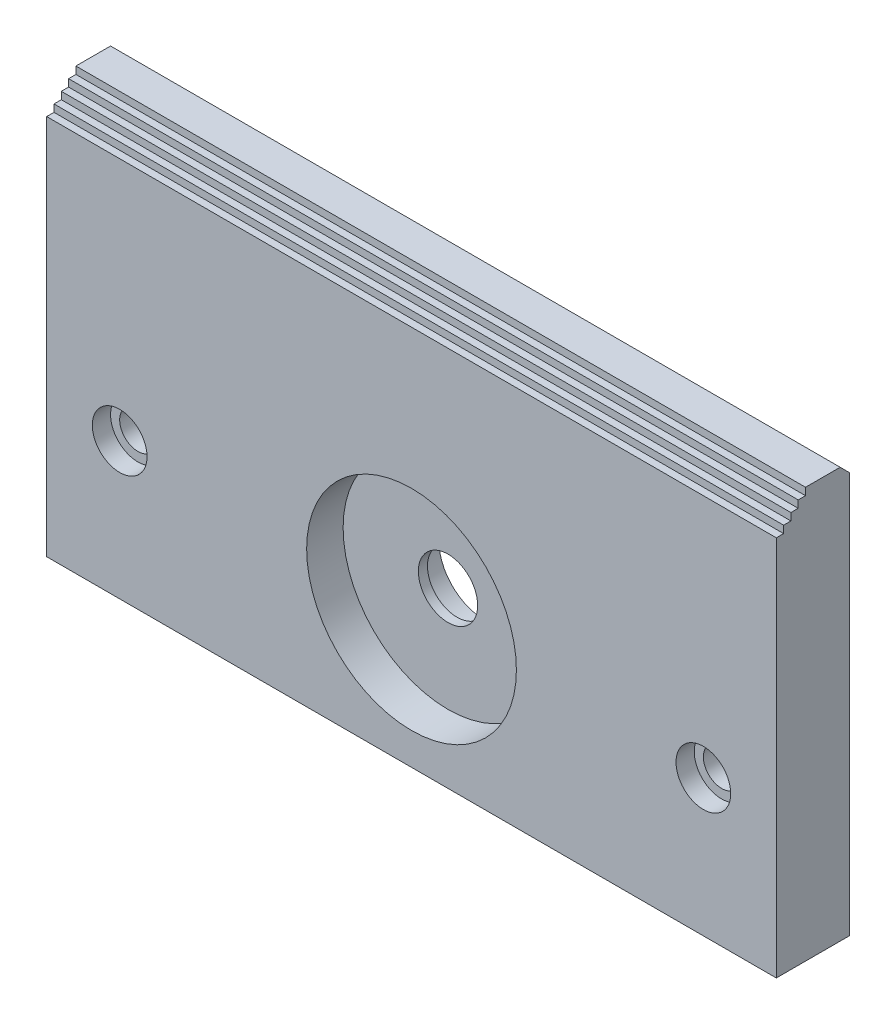
ISO-10303-21;
HEADER;
FILE_DESCRIPTION(('STEP AP214'),'2;1');
FILE_NAME('part.step','',(''),(''),'','','');
FILE_SCHEMA(('AUTOMOTIVE_DESIGN { 1 0 10303 214 1 1 1 1 }'));
ENDSEC;
DATA;
#1=APPLICATION_CONTEXT('core data for automotive mechanical design processes');
#2=APPLICATION_PROTOCOL_DEFINITION('international standard','automotive_design',2000,#1);
#3=PRODUCT_CONTEXT('',#1,'mechanical');
#4=PRODUCT('Part','Part','',(#3));
#5=PRODUCT_RELATED_PRODUCT_CATEGORY('part','',(#4));
#6=PRODUCT_DEFINITION_FORMATION('','',#4);
#7=PRODUCT_DEFINITION_CONTEXT('part definition',#1,'design');
#8=PRODUCT_DEFINITION('design','',#6,#7);
#9=PRODUCT_DEFINITION_SHAPE('','',#8);
#10=(LENGTH_UNIT() NAMED_UNIT(*) SI_UNIT(.MILLI.,.METRE.));
#11=(NAMED_UNIT(*) PLANE_ANGLE_UNIT() SI_UNIT($,.RADIAN.));
#12=(NAMED_UNIT(*) SI_UNIT($,.STERADIAN.) SOLID_ANGLE_UNIT());
#13=UNCERTAINTY_MEASURE_WITH_UNIT(LENGTH_MEASURE(1.E-05),#10,'distance_accuracy_value','');
#14=(GEOMETRIC_REPRESENTATION_CONTEXT(3) GLOBAL_UNCERTAINTY_ASSIGNED_CONTEXT((#13)) GLOBAL_UNIT_ASSIGNED_CONTEXT((#10,
#11,#12)) REPRESENTATION_CONTEXT('',''));
#15=CARTESIAN_POINT('',(0.,0.,0.));
#16=DIRECTION('',(0.,0.,1.));
#17=DIRECTION('',(1.,0.,0.));
#18=AXIS2_PLACEMENT_3D('',#15,#16,#17);
#19=CARTESIAN_POINT('',(40.,10.8333333333333,-0.0010000000000062));
#20=DIRECTION('',(0.,0.,1.));
#21=DIRECTION('',(1.,0.,0.));
#22=AXIS2_PLACEMENT_3D('',#19,#20,#21);
#23=CYLINDRICAL_SURFACE('',#22,3.25);
#24=CARTESIAN_POINT('',(40.,10.8333333333333,4.));
#25=DIRECTION('',(0.,0.,1.));
#26=DIRECTION('',(1.,0.,0.));
#27=AXIS2_PLACEMENT_3D('',#24,#25,#26);
#28=CIRCLE('',#27,3.25);
#29=CARTESIAN_POINT('',(43.25,10.8333333333333,4.));
#30=VERTEX_POINT('',#29);
#31=EDGE_CURVE('E302',#30,#30,#28,.F.);
#32=ORIENTED_EDGE('',*,*,#31,.F.);
#33=EDGE_LOOP('',(#32));
#34=FACE_BOUND('',#33,.T.);
#35=CARTESIAN_POINT('',(40.,10.8333333333333,3.));
#36=DIRECTION('',(0.,0.,-1.));
#37=DIRECTION('',(-1.,0.,0.));
#38=AXIS2_PLACEMENT_3D('',#35,#36,#37);
#39=CIRCLE('',#38,3.25);
#40=CARTESIAN_POINT('',(36.75,10.8333333333333,3.));
#41=VERTEX_POINT('',#40);
#42=EDGE_CURVE('E308',#41,#41,#39,.F.);
#43=ORIENTED_EDGE('',*,*,#42,.F.);
#44=EDGE_LOOP('',(#43));
#45=FACE_BOUND('',#44,.T.);
#46=ADVANCED_FACE('F161',(#34,#45),#23,.F.);
#47=CARTESIAN_POINT('',(80.,40.8333333333333,0.));
#48=DIRECTION('',(0.,1.,0.));
#49=DIRECTION('',(-1.,0.,0.));
#50=AXIS2_PLACEMENT_3D('',#47,#48,#49);
#51=PLANE('',#50);
#52=DIRECTION('',(-1.,0.,0.));
#53=VECTOR('',#52,1.);
#54=CARTESIAN_POINT('',(80.001,40.8333333333333,4.8));
#55=LINE('',#54,#53);
#56=CARTESIAN_POINT('',(80.,40.8333333333333,4.8));
#57=VERTEX_POINT('',#56);
#58=CARTESIAN_POINT('',(0.,40.8333333333333,4.8));
#59=VERTEX_POINT('',#58);
#60=EDGE_CURVE('E353',#57,#59,#55,.T.);
#61=ORIENTED_EDGE('',*,*,#60,.F.);
#62=DIRECTION('',(0.,0.,1.));
#63=VECTOR('',#62,1.);
#64=CARTESIAN_POINT('',(80.,40.8333333333333,0.));
#65=LINE('',#64,#63);
#66=CARTESIAN_POINT('',(80.,40.8333333333333,0.999999999999973));
#67=VERTEX_POINT('',#66);
#68=EDGE_CURVE('E298',#67,#57,#65,.T.);
#69=ORIENTED_EDGE('',*,*,#68,.F.);
#70=DIRECTION('',(-1.,0.,0.));
#71=VECTOR('',#70,1.);
#72=CARTESIAN_POINT('',(0.,40.8333333333333,0.999999999999973));
#73=LINE('',#72,#71);
#74=CARTESIAN_POINT('',(0.,40.8333333333333,0.999999999999973));
#75=VERTEX_POINT('',#74);
#76=EDGE_CURVE('E329',#67,#75,#73,.T.);
#77=ORIENTED_EDGE('',*,*,#76,.T.);
#78=DIRECTION('',(0.,0.,1.));
#79=VECTOR('',#78,1.);
#80=CARTESIAN_POINT('',(0.,40.8333333333333,0.));
#81=LINE('',#80,#79);
#82=EDGE_CURVE('E293',#75,#59,#81,.T.);
#83=ORIENTED_EDGE('',*,*,#82,.T.);
#84=EDGE_LOOP('',(#61,#69,#77,#83));
#85=FACE_BOUND('',#84,.T.);
#86=ADVANCED_FACE('F351',(#85),#51,.T.);
#87=CARTESIAN_POINT('',(0.,40.8333333333333,0.));
#88=DIRECTION('',(-1.,0.,0.));
#89=DIRECTION('',(0.,-1.,0.));
#90=AXIS2_PLACEMENT_3D('',#87,#88,#89);
#91=PLANE('',#90);
#92=DIRECTION('',(0.,0.,1.));
#93=VECTOR('',#92,1.);
#94=CARTESIAN_POINT('',(0.,37.6333333333333,7.2));
#95=LINE('',#94,#93);
#96=CARTESIAN_POINT('',(0.,37.6333333333333,7.2));
#97=VERTEX_POINT('',#96);
#98=CARTESIAN_POINT('',(0.,37.6333333333333,8.));
#99=VERTEX_POINT('',#98);
#100=EDGE_CURVE('E178',#97,#99,#95,.T.);
#101=ORIENTED_EDGE('',*,*,#100,.F.);
#102=DIRECTION('',(0.,-1.,0.));
#103=VECTOR('',#102,1.);
#104=CARTESIAN_POINT('',(0.,38.4333333333333,7.2));
#105=LINE('',#104,#103);
#106=CARTESIAN_POINT('',(0.,38.4333333333333,7.2));
#107=VERTEX_POINT('',#106);
#108=EDGE_CURVE('E364',#107,#97,#105,.T.);
#109=ORIENTED_EDGE('',*,*,#108,.F.);
#110=DIRECTION('',(0.,0.,1.));
#111=VECTOR('',#110,1.);
#112=CARTESIAN_POINT('',(0.,38.4333333333333,6.4));
#113=LINE('',#112,#111);
#114=CARTESIAN_POINT('',(0.,38.4333333333333,6.4));
#115=VERTEX_POINT('',#114);
#116=EDGE_CURVE('E439',#115,#107,#113,.T.);
#117=ORIENTED_EDGE('',*,*,#116,.F.);
#118=DIRECTION('',(0.,-1.,0.));
#119=VECTOR('',#118,1.);
#120=CARTESIAN_POINT('',(0.,39.2333333333333,6.4));
#121=LINE('',#120,#119);
#122=CARTESIAN_POINT('',(0.,39.2333333333333,6.4));
#123=VERTEX_POINT('',#122);
#124=EDGE_CURVE('E435',#123,#115,#121,.T.);
#125=ORIENTED_EDGE('',*,*,#124,.F.);
#126=DIRECTION('',(0.,0.,1.));
#127=VECTOR('',#126,1.);
#128=CARTESIAN_POINT('',(0.,39.2333333333333,5.6));
#129=LINE('',#128,#127);
#130=CARTESIAN_POINT('',(0.,39.2333333333333,5.6));
#131=VERTEX_POINT('',#130);
#132=EDGE_CURVE('E431',#131,#123,#129,.T.);
#133=ORIENTED_EDGE('',*,*,#132,.F.);
#134=DIRECTION('',(0.,-1.,0.));
#135=VECTOR('',#134,1.);
#136=CARTESIAN_POINT('',(0.,40.0333333333333,5.6));
#137=LINE('',#136,#135);
#138=CARTESIAN_POINT('',(0.,40.0333333333333,5.6));
#139=VERTEX_POINT('',#138);
#140=EDGE_CURVE('E424',#139,#131,#137,.T.);
#141=ORIENTED_EDGE('',*,*,#140,.F.);
#142=DIRECTION('',(0.,0.,1.));
#143=VECTOR('',#142,1.);
#144=CARTESIAN_POINT('',(0.,40.0333333333333,4.8));
#145=LINE('',#144,#143);
#146=CARTESIAN_POINT('',(0.,40.0333333333333,4.8));
#147=VERTEX_POINT('',#146);
#148=EDGE_CURVE('E419',#147,#139,#145,.T.);
#149=ORIENTED_EDGE('',*,*,#148,.F.);
#150=DIRECTION('',(0.,-1.,0.));
#151=VECTOR('',#150,1.);
#152=CARTESIAN_POINT('',(0.,40.8333333333333,4.8));
#153=LINE('',#152,#151);
#154=EDGE_CURVE('E271',#59,#147,#153,.T.);
#155=ORIENTED_EDGE('',*,*,#154,.F.);
#156=ORIENTED_EDGE('',*,*,#82,.F.);
#157=DIRECTION('',(0.,-0.707106781186552,-0.707106781186543));
#158=VECTOR('',#157,1.);
#159=CARTESIAN_POINT('',(0.,40.3333333333333,0.499999999999993));
#160=LINE('',#159,#158);
#161=CARTESIAN_POINT('',(0.,39.8333333333333,0.));
#162=VERTEX_POINT('',#161);
#163=EDGE_CURVE('E333',#75,#162,#160,.T.);
#164=ORIENTED_EDGE('',*,*,#163,.T.);
#165=DIRECTION('',(0.,-1.,0.));
#166=VECTOR('',#165,1.);
#167=CARTESIAN_POINT('',(0.,40.8333333333333,0.));
#168=LINE('',#167,#166);
#169=CARTESIAN_POINT('',(0.,-4.16666666666666,0.));
#170=VERTEX_POINT('',#169);
#171=EDGE_CURVE('E290',#162,#170,#168,.T.);
#172=ORIENTED_EDGE('',*,*,#171,.T.);
#173=DIRECTION('',(0.,0.,1.));
#174=VECTOR('',#173,1.);
#175=CARTESIAN_POINT('',(0.,-4.16666666666666,-0.000999999999999265));
#176=LINE('',#175,#174);
#177=CARTESIAN_POINT('',(0.,-4.16666666666666,8.));
#178=VERTEX_POINT('',#177);
#179=EDGE_CURVE('E376',#170,#178,#176,.T.);
#180=ORIENTED_EDGE('',*,*,#179,.T.);
#181=DIRECTION('',(0.,-1.,0.));
#182=VECTOR('',#181,1.);
#183=CARTESIAN_POINT('',(0.,40.8333333333333,8.));
#184=LINE('',#183,#182);
#185=EDGE_CURVE('E279',#99,#178,#184,.T.);
#186=ORIENTED_EDGE('',*,*,#185,.F.);
#187=EDGE_LOOP('',(#101,#109,#117,#125,#133,#141,#149,#155,#156,#164,#172,#180,#186));
#188=FACE_BOUND('',#187,.T.);
#189=ADVANCED_FACE('F415',(#188),#91,.T.);
#190=CARTESIAN_POINT('',(80.,-19.1666666666667,0.));
#191=DIRECTION('',(1.,0.,0.));
#192=DIRECTION('',(0.,0.,-1.));
#193=AXIS2_PLACEMENT_3D('',#190,#191,#192);
#194=PLANE('',#193);
#195=DIRECTION('',(0.,0.,1.));
#196=VECTOR('',#195,1.);
#197=CARTESIAN_POINT('',(80.,37.6333333333333,7.2));
#198=LINE('',#197,#196);
#199=CARTESIAN_POINT('',(80.,37.6333333333333,7.2));
#200=VERTEX_POINT('',#199);
#201=CARTESIAN_POINT('',(80.,37.6333333333333,8.));
#202=VERTEX_POINT('',#201);
#203=EDGE_CURVE('E258',#200,#202,#198,.T.);
#204=ORIENTED_EDGE('',*,*,#203,.T.);
#205=DIRECTION('',(0.,1.,0.));
#206=VECTOR('',#205,1.);
#207=CARTESIAN_POINT('',(80.,-19.1666666666667,8.));
#208=LINE('',#207,#206);
#209=CARTESIAN_POINT('',(80.,-4.16666666666666,8.));
#210=VERTEX_POINT('',#209);
#211=EDGE_CURVE('E186',#210,#202,#208,.T.);
#212=ORIENTED_EDGE('',*,*,#211,.F.);
#213=DIRECTION('',(0.,0.,1.));
#214=VECTOR('',#213,1.);
#215=CARTESIAN_POINT('',(80.,-4.16666666666666,-0.000999999999999265));
#216=LINE('',#215,#214);
#217=CARTESIAN_POINT('',(80.,-4.16666666666666,0.));
#218=VERTEX_POINT('',#217);
#219=EDGE_CURVE('E375',#218,#210,#216,.T.);
#220=ORIENTED_EDGE('',*,*,#219,.F.);
#221=DIRECTION('',(0.,1.,0.));
#222=VECTOR('',#221,1.);
#223=CARTESIAN_POINT('',(80.,-19.1666666666667,0.));
#224=LINE('',#223,#222);
#225=CARTESIAN_POINT('',(80.,39.8333333333334,0.));
#226=VERTEX_POINT('',#225);
#227=EDGE_CURVE('E284',#218,#226,#224,.T.);
#228=ORIENTED_EDGE('',*,*,#227,.T.);
#229=DIRECTION('',(0.,0.707106781186552,0.707106781186543));
#230=VECTOR('',#229,1.);
#231=CARTESIAN_POINT('',(80.,10.3333333333329,-29.5));
#232=LINE('',#231,#230);
#233=EDGE_CURVE('E12',#226,#67,#232,.T.);
#234=ORIENTED_EDGE('',*,*,#233,.T.);
#235=ORIENTED_EDGE('',*,*,#68,.T.);
#236=DIRECTION('',(0.,-1.,0.));
#237=VECTOR('',#236,1.);
#238=CARTESIAN_POINT('',(80.,40.8333333333333,4.8));
#239=LINE('',#238,#237);
#240=CARTESIAN_POINT('',(80.,40.0333333333333,4.8));
#241=VERTEX_POINT('',#240);
#242=EDGE_CURVE('E263',#57,#241,#239,.T.);
#243=ORIENTED_EDGE('',*,*,#242,.T.);
#244=DIRECTION('',(0.,0.,1.));
#245=VECTOR('',#244,1.);
#246=CARTESIAN_POINT('',(80.,40.0333333333333,4.8));
#247=LINE('',#246,#245);
#248=CARTESIAN_POINT('',(80.,40.0333333333333,5.6));
#249=VERTEX_POINT('',#248);
#250=EDGE_CURVE('E478',#241,#249,#247,.T.);
#251=ORIENTED_EDGE('',*,*,#250,.T.);
#252=DIRECTION('',(0.,-1.,0.));
#253=VECTOR('',#252,1.);
#254=CARTESIAN_POINT('',(80.,40.0333333333333,5.6));
#255=LINE('',#254,#253);
#256=CARTESIAN_POINT('',(80.,39.2333333333333,5.6));
#257=VERTEX_POINT('',#256);
#258=EDGE_CURVE('E466',#249,#257,#255,.T.);
#259=ORIENTED_EDGE('',*,*,#258,.T.);
#260=DIRECTION('',(0.,0.,1.));
#261=VECTOR('',#260,1.);
#262=CARTESIAN_POINT('',(80.,39.2333333333333,5.6));
#263=LINE('',#262,#261);
#264=CARTESIAN_POINT('',(80.,39.2333333333333,6.4));
#265=VERTEX_POINT('',#264);
#266=EDGE_CURVE('E476',#257,#265,#263,.T.);
#267=ORIENTED_EDGE('',*,*,#266,.T.);
#268=DIRECTION('',(0.,-1.,0.));
#269=VECTOR('',#268,1.);
#270=CARTESIAN_POINT('',(80.,39.2333333333333,6.4));
#271=LINE('',#270,#269);
#272=CARTESIAN_POINT('',(80.,38.4333333333333,6.4));
#273=VERTEX_POINT('',#272);
#274=EDGE_CURVE('E483',#265,#273,#271,.T.);
#275=ORIENTED_EDGE('',*,*,#274,.T.);
#276=DIRECTION('',(0.,0.,1.));
#277=VECTOR('',#276,1.);
#278=CARTESIAN_POINT('',(80.,38.4333333333333,6.4));
#279=LINE('',#278,#277);
#280=CARTESIAN_POINT('',(80.,38.4333333333333,7.2));
#281=VERTEX_POINT('',#280);
#282=EDGE_CURVE('E489',#273,#281,#279,.T.);
#283=ORIENTED_EDGE('',*,*,#282,.T.);
#284=DIRECTION('',(0.,-1.,0.));
#285=VECTOR('',#284,1.);
#286=CARTESIAN_POINT('',(80.,38.4333333333333,7.2));
#287=LINE('',#286,#285);
#288=EDGE_CURVE('E269',#281,#200,#287,.T.);
#289=ORIENTED_EDGE('',*,*,#288,.T.);
#290=EDGE_LOOP('',(#204,#212,#220,#228,#234,#235,#243,#251,#259,#267,#275,#283,#289));
#291=FACE_BOUND('',#290,.T.);
#292=ADVANCED_FACE('F267',(#291),#194,.T.);
#293=CARTESIAN_POINT('',(0.,0.,0.));
#294=DIRECTION('',(0.,0.,1.));
#295=DIRECTION('',(1.,0.,0.));
#296=AXIS2_PLACEMENT_3D('',#293,#294,#295);
#297=PLANE('',#296);
#298=CARTESIAN_POINT('',(72.,10.8333333333333,0.));
#299=DIRECTION('',(0.,0.,1.));
#300=DIRECTION('',(1.,0.,0.));
#301=AXIS2_PLACEMENT_3D('',#298,#299,#300);
#302=CIRCLE('',#301,3.50000000127192);
#303=CARTESIAN_POINT('',(75.5000000012719,10.8333333333333,0.));
#304=VERTEX_POINT('',#303);
#305=EDGE_CURVE('E317',#304,#304,#302,.T.);
#306=ORIENTED_EDGE('',*,*,#305,.T.);
#307=EDGE_LOOP('',(#306));
#308=FACE_BOUND('',#307,.T.);
#309=CARTESIAN_POINT('',(8.,10.8333333333333,0.));
#310=DIRECTION('',(0.,0.,1.));
#311=DIRECTION('',(1.,0.,0.));
#312=AXIS2_PLACEMENT_3D('',#309,#310,#311);
#313=CIRCLE('',#312,3.50000000127192);
#314=CARTESIAN_POINT('',(11.5000000012719,10.8333333333333,0.));
#315=VERTEX_POINT('',#314);
#316=EDGE_CURVE('E297',#315,#315,#313,.T.);
#317=ORIENTED_EDGE('',*,*,#316,.T.);
#318=EDGE_LOOP('',(#317));
#319=FACE_BOUND('',#318,.T.);
#320=CARTESIAN_POINT('',(40.,10.8333333333333,0.));
#321=DIRECTION('',(0.,0.,-1.));
#322=DIRECTION('',(-1.,0.,0.));
#323=AXIS2_PLACEMENT_3D('',#320,#321,#322);
#324=CIRCLE('',#323,5.);
#325=CARTESIAN_POINT('',(35.,10.8333333333333,0.));
#326=VERTEX_POINT('',#325);
#327=EDGE_CURVE('E380',#326,#326,#324,.T.);
#328=ORIENTED_EDGE('',*,*,#327,.F.);
#329=EDGE_LOOP('',(#328));
#330=FACE_BOUND('',#329,.T.);
#331=ORIENTED_EDGE('',*,*,#227,.F.);
#332=DIRECTION('',(1.,0.,0.));
#333=VECTOR('',#332,1.);
#334=CARTESIAN_POINT('',(0.,-4.16666666666666,0.));
#335=LINE('',#334,#333);
#336=EDGE_CURVE('E370',#170,#218,#335,.T.);
#337=ORIENTED_EDGE('',*,*,#336,.F.);
#338=ORIENTED_EDGE('',*,*,#171,.F.);
#339=DIRECTION('',(1.,0.,0.));
#340=VECTOR('',#339,1.);
#341=CARTESIAN_POINT('',(80.,39.8333333333334,0.));
#342=LINE('',#341,#340);
#343=EDGE_CURVE('E171',#162,#226,#342,.T.);
#344=ORIENTED_EDGE('',*,*,#343,.T.);
#345=EDGE_LOOP('',(#331,#337,#338,#344));
#346=FACE_BOUND('',#345,.T.);
#347=ADVANCED_FACE('F342',(#308,#319,#330,#346),#297,.F.);
#348=CARTESIAN_POINT('',(0.,0.,8.));
#349=DIRECTION('',(0.,0.,1.));
#350=DIRECTION('',(1.,0.,0.));
#351=AXIS2_PLACEMENT_3D('',#348,#349,#350);
#352=PLANE('',#351);
#353=DIRECTION('',(-1.,0.,0.));
#354=VECTOR('',#353,1.);
#355=CARTESIAN_POINT('',(80.001,37.6333333333333,8.));
#356=LINE('',#355,#354);
#357=EDGE_CURVE('E256',#202,#99,#356,.T.);
#358=ORIENTED_EDGE('',*,*,#357,.T.);
#359=ORIENTED_EDGE('',*,*,#185,.T.);
#360=DIRECTION('',(-1.,0.,0.));
#361=VECTOR('',#360,1.);
#362=CARTESIAN_POINT('',(0.,-4.16666666666666,8.));
#363=LINE('',#362,#361);
#364=EDGE_CURVE('E277',#210,#178,#363,.T.);
#365=ORIENTED_EDGE('',*,*,#364,.F.);
#366=ORIENTED_EDGE('',*,*,#211,.T.);
#367=EDGE_LOOP('',(#358,#359,#365,#366));
#368=FACE_BOUND('',#367,.T.);
#369=CARTESIAN_POINT('',(40.,10.8333333333333,8.));
#370=DIRECTION('',(0.,0.,1.));
#371=DIRECTION('',(1.,0.,0.));
#372=AXIS2_PLACEMENT_3D('',#369,#370,#371);
#373=CIRCLE('',#372,11.5);
#374=CARTESIAN_POINT('',(51.5,10.8333333333333,8.));
#375=VERTEX_POINT('',#374);
#376=EDGE_CURVE('E312',#375,#375,#373,.T.);
#377=ORIENTED_EDGE('',*,*,#376,.F.);
#378=EDGE_LOOP('',(#377));
#379=FACE_BOUND('',#378,.T.);
#380=CARTESIAN_POINT('',(8.,10.8333333333333,8.));
#381=DIRECTION('',(0.,0.,1.));
#382=DIRECTION('',(1.,0.,0.));
#383=AXIS2_PLACEMENT_3D('',#380,#381,#382);
#384=CIRCLE('',#383,2.99999999999999);
#385=CARTESIAN_POINT('',(11.,10.8333333333333,8.));
#386=VERTEX_POINT('',#385);
#387=EDGE_CURVE('E306',#386,#386,#384,.T.);
#388=ORIENTED_EDGE('',*,*,#387,.F.);
#389=EDGE_LOOP('',(#388));
#390=FACE_BOUND('',#389,.T.);
#391=CARTESIAN_POINT('',(72.,10.8333333333333,8.));
#392=DIRECTION('',(0.,0.,1.));
#393=DIRECTION('',(1.,0.,0.));
#394=AXIS2_PLACEMENT_3D('',#391,#392,#393);
#395=CIRCLE('',#394,2.99999999999999);
#396=CARTESIAN_POINT('',(75.,10.8333333333333,8.));
#397=VERTEX_POINT('',#396);
#398=EDGE_CURVE('E406',#397,#397,#395,.T.);
#399=ORIENTED_EDGE('',*,*,#398,.F.);
#400=EDGE_LOOP('',(#399));
#401=FACE_BOUND('',#400,.T.);
#402=ADVANCED_FACE('F274',(#368,#379,#390,#401),#352,.T.);
#403=CARTESIAN_POINT('',(72.,10.8333333333333,8.));
#404=DIRECTION('',(0.,0.,1.));
#405=DIRECTION('',(1.,0.,0.));
#406=AXIS2_PLACEMENT_3D('',#403,#404,#405);
#407=CYLINDRICAL_SURFACE('',#406,2.00000000000002);
#408=CARTESIAN_POINT('',(72.,10.8333333333333,1.49999999854342));
#409=DIRECTION('',(0.,0.,1.));
#410=DIRECTION('',(1.,0.,0.));
#411=AXIS2_PLACEMENT_3D('',#408,#409,#410);
#412=CIRCLE('',#411,2.00000000000002);
#413=CARTESIAN_POINT('',(74.,10.8333333333333,1.49999999854342));
#414=VERTEX_POINT('',#413);
#415=EDGE_CURVE('E321',#414,#414,#412,.F.);
#416=ORIENTED_EDGE('',*,*,#415,.T.);
#417=EDGE_LOOP('',(#416));
#418=FACE_BOUND('',#417,.T.);
#419=CARTESIAN_POINT('',(72.,10.8333333333333,6.));
#420=DIRECTION('',(0.,0.,1.));
#421=DIRECTION('',(1.,0.,0.));
#422=AXIS2_PLACEMENT_3D('',#419,#420,#421);
#423=CIRCLE('',#422,2.00000000000002);
#424=CARTESIAN_POINT('',(74.,10.8333333333333,6.));
#425=VERTEX_POINT('',#424);
#426=EDGE_CURVE('E280',#425,#425,#423,.T.);
#427=ORIENTED_EDGE('',*,*,#426,.T.);
#428=EDGE_LOOP('',(#427));
#429=FACE_BOUND('',#428,.T.);
#430=ADVANCED_FACE('F543',(#418,#429),#407,.F.);
#431=CARTESIAN_POINT('',(74.,10.8333333333333,6.));
#432=DIRECTION('',(0.,0.,-1.));
#433=DIRECTION('',(-1.,0.,0.));
#434=AXIS2_PLACEMENT_3D('',#431,#432,#433);
#435=PLANE('',#434);
#436=ORIENTED_EDGE('',*,*,#426,.F.);
#437=EDGE_LOOP('',(#436));
#438=FACE_BOUND('',#437,.T.);
#439=CARTESIAN_POINT('',(72.,10.8333333333333,6.));
#440=DIRECTION('',(0.,0.,1.));
#441=DIRECTION('',(1.,0.,0.));
#442=AXIS2_PLACEMENT_3D('',#439,#440,#441);
#443=CIRCLE('',#442,2.99999999999999);
#444=CARTESIAN_POINT('',(75.,10.8333333333333,6.));
#445=VERTEX_POINT('',#444);
#446=EDGE_CURVE('E287',#445,#445,#443,.T.);
#447=ORIENTED_EDGE('',*,*,#446,.T.);
#448=EDGE_LOOP('',(#447));
#449=FACE_BOUND('',#448,.T.);
#450=ADVANCED_FACE('F539',(#438,#449),#435,.F.);
#451=CARTESIAN_POINT('',(72.,10.8333333333333,8.));
#452=DIRECTION('',(0.,0.,1.));
#453=DIRECTION('',(1.,0.,0.));
#454=AXIS2_PLACEMENT_3D('',#451,#452,#453);
#455=CYLINDRICAL_SURFACE('',#454,2.99999999999999);
#456=ORIENTED_EDGE('',*,*,#446,.F.);
#457=EDGE_LOOP('',(#456));
#458=FACE_BOUND('',#457,.T.);
#459=ORIENTED_EDGE('',*,*,#398,.T.);
#460=EDGE_LOOP('',(#459));
#461=FACE_BOUND('',#460,.T.);
#462=ADVANCED_FACE('F535',(#458,#461),#455,.F.);
#463=CARTESIAN_POINT('',(8.,10.8333333333333,8.));
#464=DIRECTION('',(0.,0.,1.));
#465=DIRECTION('',(1.,0.,0.));
#466=AXIS2_PLACEMENT_3D('',#463,#464,#465);
#467=CYLINDRICAL_SURFACE('',#466,2.00000000000001);
#468=CARTESIAN_POINT('',(8.,10.8333333333333,1.49999999854344));
#469=DIRECTION('',(0.,0.,1.));
#470=DIRECTION('',(1.,0.,0.));
#471=AXIS2_PLACEMENT_3D('',#468,#469,#470);
#472=CIRCLE('',#471,2.00000000000001);
#473=CARTESIAN_POINT('',(10.,10.8333333333333,1.49999999854344));
#474=VERTEX_POINT('',#473);
#475=EDGE_CURVE('E325',#474,#474,#472,.F.);
#476=ORIENTED_EDGE('',*,*,#475,.T.);
#477=EDGE_LOOP('',(#476));
#478=FACE_BOUND('',#477,.T.);
#479=CARTESIAN_POINT('',(8.,10.8333333333333,6.));
#480=DIRECTION('',(0.,0.,1.));
#481=DIRECTION('',(1.,0.,0.));
#482=AXIS2_PLACEMENT_3D('',#479,#480,#481);
#483=CIRCLE('',#482,2.00000000000001);
#484=CARTESIAN_POINT('',(10.,10.8333333333333,6.));
#485=VERTEX_POINT('',#484);
#486=EDGE_CURVE('E402',#485,#485,#483,.T.);
#487=ORIENTED_EDGE('',*,*,#486,.T.);
#488=EDGE_LOOP('',(#487));
#489=FACE_BOUND('',#488,.T.);
#490=ADVANCED_FACE('F531',(#478,#489),#467,.F.);
#491=CARTESIAN_POINT('',(10.,10.8333333333333,6.));
#492=DIRECTION('',(0.,0.,-1.));
#493=DIRECTION('',(-1.,0.,0.));
#494=AXIS2_PLACEMENT_3D('',#491,#492,#493);
#495=PLANE('',#494);
#496=ORIENTED_EDGE('',*,*,#486,.F.);
#497=EDGE_LOOP('',(#496));
#498=FACE_BOUND('',#497,.T.);
#499=CARTESIAN_POINT('',(8.,10.8333333333333,6.));
#500=DIRECTION('',(0.,0.,1.));
#501=DIRECTION('',(1.,0.,0.));
#502=AXIS2_PLACEMENT_3D('',#499,#500,#501);
#503=CIRCLE('',#502,2.99999999999999);
#504=CARTESIAN_POINT('',(11.,10.8333333333333,6.));
#505=VERTEX_POINT('',#504);
#506=EDGE_CURVE('E398',#505,#505,#503,.T.);
#507=ORIENTED_EDGE('',*,*,#506,.T.);
#508=EDGE_LOOP('',(#507));
#509=FACE_BOUND('',#508,.T.);
#510=ADVANCED_FACE('F527',(#498,#509),#495,.F.);
#511=CARTESIAN_POINT('',(8.,10.8333333333333,8.));
#512=DIRECTION('',(0.,0.,1.));
#513=DIRECTION('',(1.,0.,0.));
#514=AXIS2_PLACEMENT_3D('',#511,#512,#513);
#515=CYLINDRICAL_SURFACE('',#514,2.99999999999999);
#516=ORIENTED_EDGE('',*,*,#506,.F.);
#517=EDGE_LOOP('',(#516));
#518=FACE_BOUND('',#517,.T.);
#519=ORIENTED_EDGE('',*,*,#387,.T.);
#520=EDGE_LOOP('',(#519));
#521=FACE_BOUND('',#520,.T.);
#522=ADVANCED_FACE('F523',(#518,#521),#515,.F.);
#523=CARTESIAN_POINT('',(40.,10.8333333333333,4.));
#524=DIRECTION('',(0.,0.,1.));
#525=DIRECTION('',(1.,0.,0.));
#526=AXIS2_PLACEMENT_3D('',#523,#524,#525);
#527=PLANE('',#526);
#528=CARTESIAN_POINT('',(40.,10.8333333333333,4.));
#529=DIRECTION('',(0.,0.,1.));
#530=DIRECTION('',(1.,0.,0.));
#531=AXIS2_PLACEMENT_3D('',#528,#529,#530);
#532=CIRCLE('',#531,11.5);
#533=CARTESIAN_POINT('',(51.5,10.8333333333333,4.));
#534=VERTEX_POINT('',#533);
#535=EDGE_CURVE('E307',#534,#534,#532,.T.);
#536=ORIENTED_EDGE('',*,*,#535,.T.);
#537=EDGE_LOOP('',(#536));
#538=FACE_BOUND('',#537,.T.);
#539=ORIENTED_EDGE('',*,*,#31,.T.);
#540=EDGE_LOOP('',(#539));
#541=FACE_BOUND('',#540,.T.);
#542=ADVANCED_FACE('F526',(#538,#541),#527,.T.);
#543=CARTESIAN_POINT('',(40.,10.8333333333333,4.));
#544=DIRECTION('',(0.,0.,1.));
#545=DIRECTION('',(1.,0.,0.));
#546=AXIS2_PLACEMENT_3D('',#543,#544,#545);
#547=CYLINDRICAL_SURFACE('',#546,11.5);
#548=ORIENTED_EDGE('',*,*,#535,.F.);
#549=EDGE_LOOP('',(#548));
#550=FACE_BOUND('',#549,.T.);
#551=ORIENTED_EDGE('',*,*,#376,.T.);
#552=EDGE_LOOP('',(#551));
#553=FACE_BOUND('',#552,.T.);
#554=ADVANCED_FACE('F521',(#550,#553),#547,.F.);
#555=CARTESIAN_POINT('',(40.,10.8333333333333,3.));
#556=DIRECTION('',(0.,0.,-1.));
#557=DIRECTION('',(-1.,0.,0.));
#558=AXIS2_PLACEMENT_3D('',#555,#556,#557);
#559=PLANE('',#558);
#560=CARTESIAN_POINT('',(40.,10.8333333333333,3.));
#561=DIRECTION('',(0.,0.,-1.));
#562=DIRECTION('',(-1.,0.,0.));
#563=AXIS2_PLACEMENT_3D('',#560,#561,#562);
#564=CIRCLE('',#563,5.);
#565=CARTESIAN_POINT('',(35.,10.8333333333333,3.));
#566=VERTEX_POINT('',#565);
#567=EDGE_CURVE('E313',#566,#566,#564,.T.);
#568=ORIENTED_EDGE('',*,*,#567,.T.);
#569=EDGE_LOOP('',(#568));
#570=FACE_BOUND('',#569,.T.);
#571=ORIENTED_EDGE('',*,*,#42,.T.);
#572=EDGE_LOOP('',(#571));
#573=FACE_BOUND('',#572,.T.);
#574=ADVANCED_FACE('F581',(#570,#573),#559,.T.);
#575=CARTESIAN_POINT('',(40.,10.8333333333333,3.));
#576=DIRECTION('',(0.,0.,-1.));
#577=DIRECTION('',(-1.,0.,0.));
#578=AXIS2_PLACEMENT_3D('',#575,#576,#577);
#579=CYLINDRICAL_SURFACE('',#578,5.);
#580=ORIENTED_EDGE('',*,*,#567,.F.);
#581=EDGE_LOOP('',(#580));
#582=FACE_BOUND('',#581,.T.);
#583=ORIENTED_EDGE('',*,*,#327,.T.);
#584=EDGE_LOOP('',(#583));
#585=FACE_BOUND('',#584,.T.);
#586=ADVANCED_FACE('F564',(#582,#585),#579,.F.);
#587=CARTESIAN_POINT('',(72.,10.8333333333333,0.));
#588=DIRECTION('',(0.,0.,-1.));
#589=DIRECTION('',(-1.,0.,0.));
#590=AXIS2_PLACEMENT_3D('',#587,#588,#589);
#591=CONICAL_SURFACE('',#590,3.50000000127192,0.785398164306943);
#592=ORIENTED_EDGE('',*,*,#415,.F.);
#593=EDGE_LOOP('',(#592));
#594=FACE_BOUND('',#593,.T.);
#595=ORIENTED_EDGE('',*,*,#305,.F.);
#596=EDGE_LOOP('',(#595));
#597=FACE_BOUND('',#596,.T.);
#598=ADVANCED_FACE('F558',(#594,#597),#591,.F.);
#599=CARTESIAN_POINT('',(8.,10.8333333333333,0.));
#600=DIRECTION('',(0.,0.,-1.));
#601=DIRECTION('',(-1.,0.,0.));
#602=AXIS2_PLACEMENT_3D('',#599,#600,#601);
#603=CONICAL_SURFACE('',#602,3.50000000127192,0.785398164306938);
#604=ORIENTED_EDGE('',*,*,#475,.F.);
#605=EDGE_LOOP('',(#604));
#606=FACE_BOUND('',#605,.T.);
#607=ORIENTED_EDGE('',*,*,#316,.F.);
#608=EDGE_LOOP('',(#607));
#609=FACE_BOUND('',#608,.T.);
#610=ADVANCED_FACE('F563',(#606,#609),#603,.F.);
#611=CARTESIAN_POINT('',(80.,40.8333333333333,0.999999999999973));
#612=DIRECTION('',(0.,0.707106781186543,-0.707106781186552));
#613=DIRECTION('',(1.,0.,0.));
#614=AXIS2_PLACEMENT_3D('',#611,#612,#613);
#615=PLANE('',#614);
#616=ORIENTED_EDGE('',*,*,#233,.F.);
#617=ORIENTED_EDGE('',*,*,#343,.F.);
#618=ORIENTED_EDGE('',*,*,#163,.F.);
#619=ORIENTED_EDGE('',*,*,#76,.F.);
#620=EDGE_LOOP('',(#616,#617,#618,#619));
#621=FACE_BOUND('',#620,.T.);
#622=ADVANCED_FACE('F164',(#621),#615,.T.);
#623=CARTESIAN_POINT('',(0.,-4.16666666666666,-0.000999999999999265));
#624=DIRECTION('',(0.,1.,0.));
#625=DIRECTION('',(0.,0.,1.));
#626=AXIS2_PLACEMENT_3D('',#623,#624,#625);
#627=PLANE('',#626);
#628=ORIENTED_EDGE('',*,*,#336,.T.);
#629=ORIENTED_EDGE('',*,*,#219,.T.);
#630=ORIENTED_EDGE('',*,*,#364,.T.);
#631=ORIENTED_EDGE('',*,*,#179,.F.);
#632=EDGE_LOOP('',(#628,#629,#630,#631));
#633=FACE_BOUND('',#632,.T.);
#634=ADVANCED_FACE('F508',(#633),#627,.F.);
#635=CARTESIAN_POINT('',(80.001,37.6333333333333,7.2));
#636=DIRECTION('',(0.,-1.,0.));
#637=DIRECTION('',(1.,0.,0.));
#638=AXIS2_PLACEMENT_3D('',#635,#636,#637);
#639=PLANE('',#638);
#640=DIRECTION('',(-1.,0.,0.));
#641=VECTOR('',#640,1.);
#642=CARTESIAN_POINT('',(80.001,37.6333333333333,7.2));
#643=LINE('',#642,#641);
#644=EDGE_CURVE('E264',#200,#97,#643,.T.);
#645=ORIENTED_EDGE('',*,*,#644,.T.);
#646=ORIENTED_EDGE('',*,*,#100,.T.);
#647=ORIENTED_EDGE('',*,*,#357,.F.);
#648=ORIENTED_EDGE('',*,*,#203,.F.);
#649=EDGE_LOOP('',(#645,#646,#647,#648));
#650=FACE_BOUND('',#649,.T.);
#651=ADVANCED_FACE('F257',(#650),#639,.F.);
#652=CARTESIAN_POINT('',(80.001,38.4333333333333,7.2));
#653=DIRECTION('',(0.,0.,-1.));
#654=DIRECTION('',(0.,1.,0.));
#655=AXIS2_PLACEMENT_3D('',#652,#653,#654);
#656=PLANE('',#655);
#657=DIRECTION('',(-1.,0.,0.));
#658=VECTOR('',#657,1.);
#659=CARTESIAN_POINT('',(80.001,38.4333333333333,7.2));
#660=LINE('',#659,#658);
#661=EDGE_CURVE('E448',#281,#107,#660,.T.);
#662=ORIENTED_EDGE('',*,*,#661,.T.);
#663=ORIENTED_EDGE('',*,*,#108,.T.);
#664=ORIENTED_EDGE('',*,*,#644,.F.);
#665=ORIENTED_EDGE('',*,*,#288,.F.);
#666=EDGE_LOOP('',(#662,#663,#664,#665));
#667=FACE_BOUND('',#666,.T.);
#668=ADVANCED_FACE('F500',(#667),#656,.F.);
#669=CARTESIAN_POINT('',(80.001,38.4333333333333,6.4));
#670=DIRECTION('',(0.,-1.,0.));
#671=DIRECTION('',(1.,0.,0.));
#672=AXIS2_PLACEMENT_3D('',#669,#670,#671);
#673=PLANE('',#672);
#674=DIRECTION('',(-1.,0.,0.));
#675=VECTOR('',#674,1.);
#676=CARTESIAN_POINT('',(80.001,38.4333333333333,6.4));
#677=LINE('',#676,#675);
#678=EDGE_CURVE('E451',#273,#115,#677,.T.);
#679=ORIENTED_EDGE('',*,*,#678,.T.);
#680=ORIENTED_EDGE('',*,*,#116,.T.);
#681=ORIENTED_EDGE('',*,*,#661,.F.);
#682=ORIENTED_EDGE('',*,*,#282,.F.);
#683=EDGE_LOOP('',(#679,#680,#681,#682));
#684=FACE_BOUND('',#683,.T.);
#685=ADVANCED_FACE('F495',(#684),#673,.F.);
#686=CARTESIAN_POINT('',(80.001,39.2333333333333,6.4));
#687=DIRECTION('',(0.,0.,-1.));
#688=DIRECTION('',(0.,1.,0.));
#689=AXIS2_PLACEMENT_3D('',#686,#687,#688);
#690=PLANE('',#689);
#691=DIRECTION('',(-1.,0.,0.));
#692=VECTOR('',#691,1.);
#693=CARTESIAN_POINT('',(80.001,39.2333333333333,6.4));
#694=LINE('',#693,#692);
#695=EDGE_CURVE('E454',#265,#123,#694,.T.);
#696=ORIENTED_EDGE('',*,*,#695,.T.);
#697=ORIENTED_EDGE('',*,*,#124,.T.);
#698=ORIENTED_EDGE('',*,*,#678,.F.);
#699=ORIENTED_EDGE('',*,*,#274,.F.);
#700=EDGE_LOOP('',(#696,#697,#698,#699));
#701=FACE_BOUND('',#700,.T.);
#702=ADVANCED_FACE('F497',(#701),#690,.F.);
#703=CARTESIAN_POINT('',(80.001,39.2333333333333,5.6));
#704=DIRECTION('',(0.,-1.,0.));
#705=DIRECTION('',(1.,0.,0.));
#706=AXIS2_PLACEMENT_3D('',#703,#704,#705);
#707=PLANE('',#706);
#708=DIRECTION('',(-1.,0.,0.));
#709=VECTOR('',#708,1.);
#710=CARTESIAN_POINT('',(80.001,39.2333333333333,5.6));
#711=LINE('',#710,#709);
#712=EDGE_CURVE('E457',#257,#131,#711,.T.);
#713=ORIENTED_EDGE('',*,*,#712,.T.);
#714=ORIENTED_EDGE('',*,*,#132,.T.);
#715=ORIENTED_EDGE('',*,*,#695,.F.);
#716=ORIENTED_EDGE('',*,*,#266,.F.);
#717=EDGE_LOOP('',(#713,#714,#715,#716));
#718=FACE_BOUND('',#717,.T.);
#719=ADVANCED_FACE('F474',(#718),#707,.F.);
#720=CARTESIAN_POINT('',(80.001,40.0333333333333,5.6));
#721=DIRECTION('',(0.,0.,-1.));
#722=DIRECTION('',(-1.,0.,0.));
#723=AXIS2_PLACEMENT_3D('',#720,#721,#722);
#724=PLANE('',#723);
#725=DIRECTION('',(-1.,0.,0.));
#726=VECTOR('',#725,1.);
#727=CARTESIAN_POINT('',(80.001,40.0333333333333,5.6));
#728=LINE('',#727,#726);
#729=EDGE_CURVE('E362',#249,#139,#728,.T.);
#730=ORIENTED_EDGE('',*,*,#729,.T.);
#731=ORIENTED_EDGE('',*,*,#140,.T.);
#732=ORIENTED_EDGE('',*,*,#712,.F.);
#733=ORIENTED_EDGE('',*,*,#258,.F.);
#734=EDGE_LOOP('',(#730,#731,#732,#733));
#735=FACE_BOUND('',#734,.T.);
#736=ADVANCED_FACE('F462',(#735),#724,.F.);
#737=CARTESIAN_POINT('',(80.001,40.0333333333333,4.8));
#738=DIRECTION('',(0.,-1.,0.));
#739=DIRECTION('',(1.,0.,0.));
#740=AXIS2_PLACEMENT_3D('',#737,#738,#739);
#741=PLANE('',#740);
#742=DIRECTION('',(-1.,0.,0.));
#743=VECTOR('',#742,1.);
#744=CARTESIAN_POINT('',(80.001,40.0333333333333,4.8));
#745=LINE('',#744,#743);
#746=EDGE_CURVE('E358',#241,#147,#745,.T.);
#747=ORIENTED_EDGE('',*,*,#746,.T.);
#748=ORIENTED_EDGE('',*,*,#148,.T.);
#749=ORIENTED_EDGE('',*,*,#729,.F.);
#750=ORIENTED_EDGE('',*,*,#250,.F.);
#751=EDGE_LOOP('',(#747,#748,#749,#750));
#752=FACE_BOUND('',#751,.T.);
#753=ADVANCED_FACE('F469',(#752),#741,.F.);
#754=CARTESIAN_POINT('',(80.001,40.8333333333333,4.8));
#755=DIRECTION('',(0.,0.,-1.));
#756=DIRECTION('',(-1.,0.,0.));
#757=AXIS2_PLACEMENT_3D('',#754,#755,#756);
#758=PLANE('',#757);
#759=ORIENTED_EDGE('',*,*,#60,.T.);
#760=ORIENTED_EDGE('',*,*,#154,.T.);
#761=ORIENTED_EDGE('',*,*,#746,.F.);
#762=ORIENTED_EDGE('',*,*,#242,.F.);
#763=EDGE_LOOP('',(#759,#760,#761,#762));
#764=FACE_BOUND('',#763,.T.);
#765=ADVANCED_FACE('F741',(#764),#758,.F.);
#766=CLOSED_SHELL('',(#46,#86,#189,#292,#347,#402,#430,#450,#462,#490,#510,#522,#542,#554,#574,
#586,#598,#610,#622,#634,#651,#668,#685,#702,#719,#736,#753,#765));
#767=MANIFOLD_SOLID_BREP('B2',#766);
#768=ADVANCED_BREP_SHAPE_REPRESENTATION('',(#18,#767),#14);
#769=SHAPE_DEFINITION_REPRESENTATION(#9,#768);
ENDSEC;
END-ISO-10303-21;
